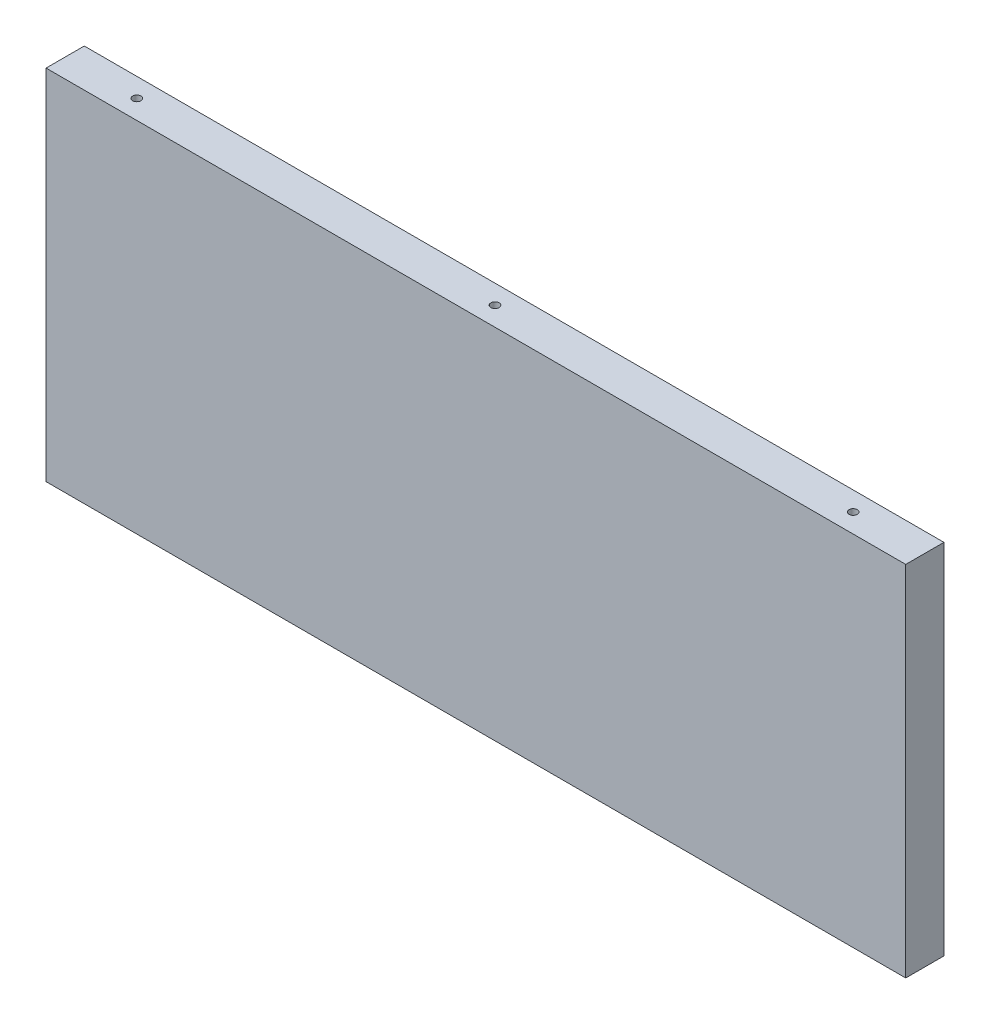
ISO-10303-21;
HEADER;
FILE_DESCRIPTION(('STEP AP214'),'2;1');
FILE_NAME('part.step','',(''),(''),'','','');
FILE_SCHEMA(('AUTOMOTIVE_DESIGN { 1 0 10303 214 1 1 1 1 }'));
ENDSEC;
DATA;
#1=APPLICATION_CONTEXT('core data for automotive mechanical design processes');
#2=APPLICATION_PROTOCOL_DEFINITION('international standard','automotive_design',2000,#1);
#3=PRODUCT_CONTEXT('',#1,'mechanical');
#4=PRODUCT('Part','Part','',(#3));
#5=PRODUCT_RELATED_PRODUCT_CATEGORY('part','',(#4));
#6=PRODUCT_DEFINITION_FORMATION('','',#4);
#7=PRODUCT_DEFINITION_CONTEXT('part definition',#1,'design');
#8=PRODUCT_DEFINITION('design','',#6,#7);
#9=PRODUCT_DEFINITION_SHAPE('','',#8);
#10=(LENGTH_UNIT() NAMED_UNIT(*) SI_UNIT(.MILLI.,.METRE.));
#11=(NAMED_UNIT(*) PLANE_ANGLE_UNIT() SI_UNIT($,.RADIAN.));
#12=(NAMED_UNIT(*) SI_UNIT($,.STERADIAN.) SOLID_ANGLE_UNIT());
#13=UNCERTAINTY_MEASURE_WITH_UNIT(LENGTH_MEASURE(1.E-05),#10,'distance_accuracy_value','');
#14=(GEOMETRIC_REPRESENTATION_CONTEXT(3) GLOBAL_UNCERTAINTY_ASSIGNED_CONTEXT((#13)) GLOBAL_UNIT_ASSIGNED_CONTEXT((#10,
#11,#12)) REPRESENTATION_CONTEXT('',''));
#15=CARTESIAN_POINT('',(0.,0.,0.));
#16=DIRECTION('',(0.,0.,1.));
#17=DIRECTION('',(1.,0.,0.));
#18=AXIS2_PLACEMENT_3D('',#15,#16,#17);
#19=CARTESIAN_POINT('',(180.,-75.,8.));
#20=DIRECTION('',(-1.,0.,0.));
#21=DIRECTION('',(0.,0.,1.));
#22=AXIS2_PLACEMENT_3D('',#19,#20,#21);
#23=PLANE('',#22);
#24=DIRECTION('',(0.,1.,0.));
#25=VECTOR('',#24,1.);
#26=CARTESIAN_POINT('',(180.,-75.,-8.));
#27=LINE('',#26,#25);
#28=CARTESIAN_POINT('',(180.,-75.,-8.));
#29=VERTEX_POINT('',#28);
#30=CARTESIAN_POINT('',(180.,75.,-8.));
#31=VERTEX_POINT('',#30);
#32=EDGE_CURVE('E187',#29,#31,#27,.T.);
#33=ORIENTED_EDGE('',*,*,#32,.T.);
#34=DIRECTION('',(0.,0.,-1.));
#35=VECTOR('',#34,1.);
#36=CARTESIAN_POINT('',(180.,75.,8.));
#37=LINE('',#36,#35);
#38=CARTESIAN_POINT('',(180.,75.,8.));
#39=VERTEX_POINT('',#38);
#40=EDGE_CURVE('E11',#39,#31,#37,.T.);
#41=ORIENTED_EDGE('',*,*,#40,.F.);
#42=DIRECTION('',(0.,1.,0.));
#43=VECTOR('',#42,1.);
#44=CARTESIAN_POINT('',(180.,-75.,8.));
#45=LINE('',#44,#43);
#46=CARTESIAN_POINT('',(180.,-75.,8.));
#47=VERTEX_POINT('',#46);
#48=EDGE_CURVE('E188',#47,#39,#45,.T.);
#49=ORIENTED_EDGE('',*,*,#48,.F.);
#50=DIRECTION('',(0.,0.,-1.));
#51=VECTOR('',#50,1.);
#52=CARTESIAN_POINT('',(180.,-75.,8.));
#53=LINE('',#52,#51);
#54=EDGE_CURVE('E194',#47,#29,#53,.T.);
#55=ORIENTED_EDGE('',*,*,#54,.T.);
#56=EDGE_LOOP('',(#33,#41,#49,#55));
#57=FACE_BOUND('',#56,.T.);
#58=ADVANCED_FACE('F49',(#57),#23,.F.);
#59=CARTESIAN_POINT('',(-180.,75.,8.));
#60=DIRECTION('',(0.,-1.,0.));
#61=DIRECTION('',(0.,0.,-1.));
#62=AXIS2_PLACEMENT_3D('',#59,#60,#61);
#63=PLANE('',#62);
#64=CARTESIAN_POINT('',(150.,75.,0.));
#65=DIRECTION('',(0.,1.,0.));
#66=DIRECTION('',(0.,0.,1.));
#67=AXIS2_PLACEMENT_3D('',#64,#65,#66);
#68=CIRCLE('',#67,1.72719999999998);
#69=CARTESIAN_POINT('',(150.,75.,1.72720000000001));
#70=VERTEX_POINT('',#69);
#71=EDGE_CURVE('E135',#70,#70,#68,.T.);
#72=ORIENTED_EDGE('',*,*,#71,.F.);
#73=EDGE_LOOP('',(#72));
#74=FACE_BOUND('',#73,.T.);
#75=CARTESIAN_POINT('',(0.,75.,0.));
#76=DIRECTION('',(0.,1.,0.));
#77=DIRECTION('',(0.,0.,1.));
#78=AXIS2_PLACEMENT_3D('',#75,#76,#77);
#79=CIRCLE('',#78,1.7272);
#80=CARTESIAN_POINT('',(0.,75.,1.72720000000002));
#81=VERTEX_POINT('',#80);
#82=EDGE_CURVE('E134',#81,#81,#79,.T.);
#83=ORIENTED_EDGE('',*,*,#82,.F.);
#84=EDGE_LOOP('',(#83));
#85=FACE_BOUND('',#84,.T.);
#86=CARTESIAN_POINT('',(-150.,75.,0.));
#87=DIRECTION('',(0.,1.,0.));
#88=DIRECTION('',(0.,0.,1.));
#89=AXIS2_PLACEMENT_3D('',#86,#87,#88);
#90=CIRCLE('',#89,1.72719999999998);
#91=CARTESIAN_POINT('',(-150.,75.,1.72720000000001));
#92=VERTEX_POINT('',#91);
#93=EDGE_CURVE('E145',#92,#92,#90,.T.);
#94=ORIENTED_EDGE('',*,*,#93,.F.);
#95=EDGE_LOOP('',(#94));
#96=FACE_BOUND('',#95,.T.);
#97=DIRECTION('',(-1.,0.,0.));
#98=VECTOR('',#97,1.);
#99=CARTESIAN_POINT('',(-180.,75.,-8.));
#100=LINE('',#99,#98);
#101=CARTESIAN_POINT('',(-180.,75.,-8.));
#102=VERTEX_POINT('',#101);
#103=EDGE_CURVE('E197',#31,#102,#100,.T.);
#104=ORIENTED_EDGE('',*,*,#103,.T.);
#105=DIRECTION('',(0.,0.,-1.));
#106=VECTOR('',#105,1.);
#107=CARTESIAN_POINT('',(-180.,75.,8.));
#108=LINE('',#107,#106);
#109=CARTESIAN_POINT('',(-180.,75.,8.));
#110=VERTEX_POINT('',#109);
#111=EDGE_CURVE('E57',#110,#102,#108,.T.);
#112=ORIENTED_EDGE('',*,*,#111,.F.);
#113=DIRECTION('',(-1.,0.,0.));
#114=VECTOR('',#113,1.);
#115=CARTESIAN_POINT('',(-180.,75.,8.));
#116=LINE('',#115,#114);
#117=EDGE_CURVE('E96',#39,#110,#116,.T.);
#118=ORIENTED_EDGE('',*,*,#117,.F.);
#119=ORIENTED_EDGE('',*,*,#40,.T.);
#120=EDGE_LOOP('',(#104,#112,#118,#119));
#121=FACE_BOUND('',#120,.T.);
#122=ADVANCED_FACE('F223',(#74,#85,#96,#121),#63,.F.);
#123=CARTESIAN_POINT('',(-180.,-75.,8.));
#124=DIRECTION('',(1.,0.,0.));
#125=DIRECTION('',(0.,0.,-1.));
#126=AXIS2_PLACEMENT_3D('',#123,#124,#125);
#127=PLANE('',#126);
#128=DIRECTION('',(0.,-1.,0.));
#129=VECTOR('',#128,1.);
#130=CARTESIAN_POINT('',(-180.,-75.,-8.));
#131=LINE('',#130,#129);
#132=CARTESIAN_POINT('',(-180.,-75.,-8.));
#133=VERTEX_POINT('',#132);
#134=EDGE_CURVE('E83',#102,#133,#131,.T.);
#135=ORIENTED_EDGE('',*,*,#134,.T.);
#136=DIRECTION('',(0.,0.,-1.));
#137=VECTOR('',#136,1.);
#138=CARTESIAN_POINT('',(-180.,-75.,8.));
#139=LINE('',#138,#137);
#140=CARTESIAN_POINT('',(-180.,-75.,8.));
#141=VERTEX_POINT('',#140);
#142=EDGE_CURVE('E202',#141,#133,#139,.T.);
#143=ORIENTED_EDGE('',*,*,#142,.F.);
#144=DIRECTION('',(0.,-1.,0.));
#145=VECTOR('',#144,1.);
#146=CARTESIAN_POINT('',(-180.,-75.,8.));
#147=LINE('',#146,#145);
#148=EDGE_CURVE('E191',#110,#141,#147,.T.);
#149=ORIENTED_EDGE('',*,*,#148,.F.);
#150=ORIENTED_EDGE('',*,*,#111,.T.);
#151=EDGE_LOOP('',(#135,#143,#149,#150));
#152=FACE_BOUND('',#151,.T.);
#153=ADVANCED_FACE('F204',(#152),#127,.F.);
#154=CARTESIAN_POINT('',(-180.,-75.,8.));
#155=DIRECTION('',(0.,1.,0.));
#156=DIRECTION('',(0.,0.,1.));
#157=AXIS2_PLACEMENT_3D('',#154,#155,#156);
#158=PLANE('',#157);
#159=CARTESIAN_POINT('',(127.,-75.,0.));
#160=DIRECTION('',(0.,-1.,0.));
#161=DIRECTION('',(0.,0.,-1.));
#162=AXIS2_PLACEMENT_3D('',#159,#160,#161);
#163=CIRCLE('',#162,5.);
#164=CARTESIAN_POINT('',(127.,-75.,-5.));
#165=VERTEX_POINT('',#164);
#166=EDGE_CURVE('E151',#165,#165,#163,.T.);
#167=ORIENTED_EDGE('',*,*,#166,.F.);
#168=EDGE_LOOP('',(#167));
#169=FACE_BOUND('',#168,.T.);
#170=CARTESIAN_POINT('',(142.5,-75.,0.));
#171=DIRECTION('',(0.,-1.,0.));
#172=DIRECTION('',(0.,0.,-1.));
#173=AXIS2_PLACEMENT_3D('',#170,#171,#172);
#174=CIRCLE('',#173,1.72719999999998);
#175=CARTESIAN_POINT('',(142.5,-75.,-1.72719999999998));
#176=VERTEX_POINT('',#175);
#177=EDGE_CURVE('E157',#176,#176,#174,.T.);
#178=ORIENTED_EDGE('',*,*,#177,.F.);
#179=EDGE_LOOP('',(#178));
#180=FACE_BOUND('',#179,.T.);
#181=CARTESIAN_POINT('',(111.5,-75.,0.));
#182=DIRECTION('',(0.,-1.,0.));
#183=DIRECTION('',(0.,0.,-1.));
#184=AXIS2_PLACEMENT_3D('',#181,#182,#183);
#185=CIRCLE('',#184,1.7272);
#186=CARTESIAN_POINT('',(111.5,-75.,-1.7272));
#187=VERTEX_POINT('',#186);
#188=EDGE_CURVE('E163',#187,#187,#185,.T.);
#189=ORIENTED_EDGE('',*,*,#188,.F.);
#190=EDGE_LOOP('',(#189));
#191=FACE_BOUND('',#190,.T.);
#192=CARTESIAN_POINT('',(-127.,-75.,0.));
#193=DIRECTION('',(0.,-1.,0.));
#194=DIRECTION('',(0.,0.,-1.));
#195=AXIS2_PLACEMENT_3D('',#192,#193,#194);
#196=CIRCLE('',#195,4.99999999999999);
#197=CARTESIAN_POINT('',(-127.,-75.,-4.99999999999999));
#198=VERTEX_POINT('',#197);
#199=EDGE_CURVE('E169',#198,#198,#196,.T.);
#200=ORIENTED_EDGE('',*,*,#199,.F.);
#201=EDGE_LOOP('',(#200));
#202=FACE_BOUND('',#201,.T.);
#203=CARTESIAN_POINT('',(-142.5,-75.,0.));
#204=DIRECTION('',(0.,-1.,0.));
#205=DIRECTION('',(0.,0.,-1.));
#206=AXIS2_PLACEMENT_3D('',#203,#204,#205);
#207=CIRCLE('',#206,1.72719999999998);
#208=CARTESIAN_POINT('',(-142.5,-75.,-1.72719999999998));
#209=VERTEX_POINT('',#208);
#210=EDGE_CURVE('E175',#209,#209,#207,.T.);
#211=ORIENTED_EDGE('',*,*,#210,.F.);
#212=EDGE_LOOP('',(#211));
#213=FACE_BOUND('',#212,.T.);
#214=CARTESIAN_POINT('',(-111.5,-75.,0.));
#215=DIRECTION('',(0.,-1.,0.));
#216=DIRECTION('',(0.,0.,-1.));
#217=AXIS2_PLACEMENT_3D('',#214,#215,#216);
#218=CIRCLE('',#217,1.7272);
#219=CARTESIAN_POINT('',(-111.5,-75.,-1.7272));
#220=VERTEX_POINT('',#219);
#221=EDGE_CURVE('E181',#220,#220,#218,.T.);
#222=ORIENTED_EDGE('',*,*,#221,.F.);
#223=EDGE_LOOP('',(#222));
#224=FACE_BOUND('',#223,.T.);
#225=DIRECTION('',(1.,0.,0.));
#226=VECTOR('',#225,1.);
#227=CARTESIAN_POINT('',(-180.,-75.,-8.));
#228=LINE('',#227,#226);
#229=EDGE_CURVE('E89',#133,#29,#228,.T.);
#230=ORIENTED_EDGE('',*,*,#229,.T.);
#231=ORIENTED_EDGE('',*,*,#54,.F.);
#232=DIRECTION('',(1.,0.,0.));
#233=VECTOR('',#232,1.);
#234=CARTESIAN_POINT('',(-180.,-75.,8.));
#235=LINE('',#234,#233);
#236=EDGE_CURVE('E65',#141,#47,#235,.T.);
#237=ORIENTED_EDGE('',*,*,#236,.F.);
#238=ORIENTED_EDGE('',*,*,#142,.T.);
#239=EDGE_LOOP('',(#230,#231,#237,#238));
#240=FACE_BOUND('',#239,.T.);
#241=ADVANCED_FACE('F211',(#169,#180,#191,#202,#213,#224,#240),#158,.F.);
#242=CARTESIAN_POINT('',(0.,0.,8.));
#243=DIRECTION('',(0.,0.,-1.));
#244=DIRECTION('',(-1.,0.,0.));
#245=AXIS2_PLACEMENT_3D('',#242,#243,#244);
#246=PLANE('',#245);
#247=ORIENTED_EDGE('',*,*,#48,.T.);
#248=ORIENTED_EDGE('',*,*,#117,.T.);
#249=ORIENTED_EDGE('',*,*,#148,.T.);
#250=ORIENTED_EDGE('',*,*,#236,.T.);
#251=EDGE_LOOP('',(#247,#248,#249,#250));
#252=FACE_BOUND('',#251,.T.);
#253=ADVANCED_FACE('F213',(#252),#246,.F.);
#254=CARTESIAN_POINT('',(0.,0.,-8.));
#255=DIRECTION('',(0.,0.,-1.));
#256=DIRECTION('',(-1.,0.,0.));
#257=AXIS2_PLACEMENT_3D('',#254,#255,#256);
#258=PLANE('',#257);
#259=ORIENTED_EDGE('',*,*,#32,.F.);
#260=ORIENTED_EDGE('',*,*,#229,.F.);
#261=ORIENTED_EDGE('',*,*,#134,.F.);
#262=ORIENTED_EDGE('',*,*,#103,.F.);
#263=EDGE_LOOP('',(#259,#260,#261,#262));
#264=FACE_BOUND('',#263,.T.);
#265=ADVANCED_FACE('F207',(#264),#258,.T.);
#266=CARTESIAN_POINT('',(-111.5,-50.,0.));
#267=DIRECTION('',(0.,-1.,0.));
#268=DIRECTION('',(0.,0.,-1.));
#269=AXIS2_PLACEMENT_3D('',#266,#267,#268);
#270=CONICAL_SURFACE('',#269,1.7272,1.02974425867665);
#271=CARTESIAN_POINT('',(-111.5,-48.9621935388156,0.));
#272=VERTEX_POINT('',#271);
#273=VERTEX_LOOP('',#272);
#274=FACE_BOUND('',#273,.T.);
#275=CARTESIAN_POINT('',(-111.5,-50.,0.));
#276=DIRECTION('',(0.,-1.,0.));
#277=DIRECTION('',(0.,0.,-1.));
#278=AXIS2_PLACEMENT_3D('',#275,#276,#277);
#279=CIRCLE('',#278,1.7272);
#280=CARTESIAN_POINT('',(-111.5,-50.,-1.7272));
#281=VERTEX_POINT('',#280);
#282=EDGE_CURVE('E184',#281,#281,#279,.T.);
#283=ORIENTED_EDGE('',*,*,#282,.T.);
#284=EDGE_LOOP('',(#283));
#285=FACE_BOUND('',#284,.T.);
#286=ADVANCED_FACE('F304',(#274,#285),#270,.F.);
#287=CARTESIAN_POINT('',(-111.5,-75.,0.));
#288=DIRECTION('',(0.,-1.,0.));
#289=DIRECTION('',(0.,0.,-1.));
#290=AXIS2_PLACEMENT_3D('',#287,#288,#289);
#291=CYLINDRICAL_SURFACE('',#290,1.7272);
#292=ORIENTED_EDGE('',*,*,#282,.F.);
#293=EDGE_LOOP('',(#292));
#294=FACE_BOUND('',#293,.T.);
#295=ORIENTED_EDGE('',*,*,#221,.T.);
#296=EDGE_LOOP('',(#295));
#297=FACE_BOUND('',#296,.T.);
#298=ADVANCED_FACE('F300',(#294,#297),#291,.F.);
#299=CARTESIAN_POINT('',(-142.5,-50.,0.));
#300=DIRECTION('',(0.,-1.,0.));
#301=DIRECTION('',(0.,0.,-1.));
#302=AXIS2_PLACEMENT_3D('',#299,#300,#301);
#303=CONICAL_SURFACE('',#302,1.72719999999998,1.02974425867665);
#304=CARTESIAN_POINT('',(-142.5,-48.9621935388156,0.));
#305=VERTEX_POINT('',#304);
#306=VERTEX_LOOP('',#305);
#307=FACE_BOUND('',#306,.T.);
#308=CARTESIAN_POINT('',(-142.5,-50.,0.));
#309=DIRECTION('',(0.,-1.,0.));
#310=DIRECTION('',(0.,0.,-1.));
#311=AXIS2_PLACEMENT_3D('',#308,#309,#310);
#312=CIRCLE('',#311,1.72719999999998);
#313=CARTESIAN_POINT('',(-142.5,-50.,-1.72719999999998));
#314=VERTEX_POINT('',#313);
#315=EDGE_CURVE('E178',#314,#314,#312,.T.);
#316=ORIENTED_EDGE('',*,*,#315,.T.);
#317=EDGE_LOOP('',(#316));
#318=FACE_BOUND('',#317,.T.);
#319=ADVANCED_FACE('F296',(#307,#318),#303,.F.);
#320=CARTESIAN_POINT('',(-142.5,-75.,0.));
#321=DIRECTION('',(0.,-1.,0.));
#322=DIRECTION('',(0.,0.,-1.));
#323=AXIS2_PLACEMENT_3D('',#320,#321,#322);
#324=CYLINDRICAL_SURFACE('',#323,1.72719999999998);
#325=ORIENTED_EDGE('',*,*,#315,.F.);
#326=EDGE_LOOP('',(#325));
#327=FACE_BOUND('',#326,.T.);
#328=ORIENTED_EDGE('',*,*,#210,.T.);
#329=EDGE_LOOP('',(#328));
#330=FACE_BOUND('',#329,.T.);
#331=ADVANCED_FACE('F292',(#327,#330),#324,.F.);
#332=CARTESIAN_POINT('',(-127.,-30.,0.));
#333=DIRECTION('',(0.,-1.,0.));
#334=DIRECTION('',(0.,0.,-1.));
#335=AXIS2_PLACEMENT_3D('',#332,#333,#334);
#336=CONICAL_SURFACE('',#335,4.99999999999999,1.02974425867665);
#337=CARTESIAN_POINT('',(-127.,-26.9956969048622,0.));
#338=VERTEX_POINT('',#337);
#339=VERTEX_LOOP('',#338);
#340=FACE_BOUND('',#339,.T.);
#341=CARTESIAN_POINT('',(-127.,-30.,0.));
#342=DIRECTION('',(0.,-1.,0.));
#343=DIRECTION('',(0.,0.,-1.));
#344=AXIS2_PLACEMENT_3D('',#341,#342,#343);
#345=CIRCLE('',#344,4.99999999999999);
#346=CARTESIAN_POINT('',(-127.,-30.,-4.99999999999999));
#347=VERTEX_POINT('',#346);
#348=EDGE_CURVE('E172',#347,#347,#345,.T.);
#349=ORIENTED_EDGE('',*,*,#348,.T.);
#350=EDGE_LOOP('',(#349));
#351=FACE_BOUND('',#350,.T.);
#352=ADVANCED_FACE('F288',(#340,#351),#336,.F.);
#353=CARTESIAN_POINT('',(-127.,-75.,0.));
#354=DIRECTION('',(0.,-1.,0.));
#355=DIRECTION('',(0.,0.,-1.));
#356=AXIS2_PLACEMENT_3D('',#353,#354,#355);
#357=CYLINDRICAL_SURFACE('',#356,4.99999999999999);
#358=ORIENTED_EDGE('',*,*,#348,.F.);
#359=EDGE_LOOP('',(#358));
#360=FACE_BOUND('',#359,.T.);
#361=ORIENTED_EDGE('',*,*,#199,.T.);
#362=EDGE_LOOP('',(#361));
#363=FACE_BOUND('',#362,.T.);
#364=ADVANCED_FACE('F284',(#360,#363),#357,.F.);
#365=CARTESIAN_POINT('',(111.5,-50.,0.));
#366=DIRECTION('',(0.,-1.,0.));
#367=DIRECTION('',(0.,0.,-1.));
#368=AXIS2_PLACEMENT_3D('',#365,#366,#367);
#369=CONICAL_SURFACE('',#368,1.7272,1.02974425867665);
#370=CARTESIAN_POINT('',(111.5,-48.9621935388156,0.));
#371=VERTEX_POINT('',#370);
#372=VERTEX_LOOP('',#371);
#373=FACE_BOUND('',#372,.T.);
#374=CARTESIAN_POINT('',(111.5,-50.,0.));
#375=DIRECTION('',(0.,-1.,0.));
#376=DIRECTION('',(0.,0.,-1.));
#377=AXIS2_PLACEMENT_3D('',#374,#375,#376);
#378=CIRCLE('',#377,1.7272);
#379=CARTESIAN_POINT('',(111.5,-50.,-1.7272));
#380=VERTEX_POINT('',#379);
#381=EDGE_CURVE('E166',#380,#380,#378,.T.);
#382=ORIENTED_EDGE('',*,*,#381,.T.);
#383=EDGE_LOOP('',(#382));
#384=FACE_BOUND('',#383,.T.);
#385=ADVANCED_FACE('F280',(#373,#384),#369,.F.);
#386=CARTESIAN_POINT('',(111.5,-75.,0.));
#387=DIRECTION('',(0.,-1.,0.));
#388=DIRECTION('',(0.,0.,-1.));
#389=AXIS2_PLACEMENT_3D('',#386,#387,#388);
#390=CYLINDRICAL_SURFACE('',#389,1.7272);
#391=ORIENTED_EDGE('',*,*,#381,.F.);
#392=EDGE_LOOP('',(#391));
#393=FACE_BOUND('',#392,.T.);
#394=ORIENTED_EDGE('',*,*,#188,.T.);
#395=EDGE_LOOP('',(#394));
#396=FACE_BOUND('',#395,.T.);
#397=ADVANCED_FACE('F276',(#393,#396),#390,.F.);
#398=CARTESIAN_POINT('',(142.5,-50.,0.));
#399=DIRECTION('',(0.,-1.,0.));
#400=DIRECTION('',(0.,0.,-1.));
#401=AXIS2_PLACEMENT_3D('',#398,#399,#400);
#402=CONICAL_SURFACE('',#401,1.72719999999998,1.02974425867665);
#403=CARTESIAN_POINT('',(142.5,-48.9621935388156,0.));
#404=VERTEX_POINT('',#403);
#405=VERTEX_LOOP('',#404);
#406=FACE_BOUND('',#405,.T.);
#407=CARTESIAN_POINT('',(142.5,-50.,0.));
#408=DIRECTION('',(0.,-1.,0.));
#409=DIRECTION('',(0.,0.,-1.));
#410=AXIS2_PLACEMENT_3D('',#407,#408,#409);
#411=CIRCLE('',#410,1.72719999999998);
#412=CARTESIAN_POINT('',(142.5,-50.,-1.72719999999998));
#413=VERTEX_POINT('',#412);
#414=EDGE_CURVE('E160',#413,#413,#411,.T.);
#415=ORIENTED_EDGE('',*,*,#414,.T.);
#416=EDGE_LOOP('',(#415));
#417=FACE_BOUND('',#416,.T.);
#418=ADVANCED_FACE('F272',(#406,#417),#402,.F.);
#419=CARTESIAN_POINT('',(142.5,-75.,0.));
#420=DIRECTION('',(0.,-1.,0.));
#421=DIRECTION('',(0.,0.,-1.));
#422=AXIS2_PLACEMENT_3D('',#419,#420,#421);
#423=CYLINDRICAL_SURFACE('',#422,1.72719999999998);
#424=ORIENTED_EDGE('',*,*,#414,.F.);
#425=EDGE_LOOP('',(#424));
#426=FACE_BOUND('',#425,.T.);
#427=ORIENTED_EDGE('',*,*,#177,.T.);
#428=EDGE_LOOP('',(#427));
#429=FACE_BOUND('',#428,.T.);
#430=ADVANCED_FACE('F268',(#426,#429),#423,.F.);
#431=CARTESIAN_POINT('',(127.,-30.,0.));
#432=DIRECTION('',(0.,-1.,0.));
#433=DIRECTION('',(0.,0.,-1.));
#434=AXIS2_PLACEMENT_3D('',#431,#432,#433);
#435=CONICAL_SURFACE('',#434,4.99999999999998,1.02974425867665);
#436=CARTESIAN_POINT('',(127.,-26.9956969048622,0.));
#437=VERTEX_POINT('',#436);
#438=VERTEX_LOOP('',#437);
#439=FACE_BOUND('',#438,.T.);
#440=CARTESIAN_POINT('',(127.,-30.,0.));
#441=DIRECTION('',(0.,-1.,0.));
#442=DIRECTION('',(0.,0.,-1.));
#443=AXIS2_PLACEMENT_3D('',#440,#441,#442);
#444=CIRCLE('',#443,4.99999999999998);
#445=CARTESIAN_POINT('',(127.,-30.,-4.99999999999998));
#446=VERTEX_POINT('',#445);
#447=EDGE_CURVE('E154',#446,#446,#444,.T.);
#448=ORIENTED_EDGE('',*,*,#447,.T.);
#449=EDGE_LOOP('',(#448));
#450=FACE_BOUND('',#449,.T.);
#451=ADVANCED_FACE('F264',(#439,#450),#435,.F.);
#452=CARTESIAN_POINT('',(127.,-75.,0.));
#453=DIRECTION('',(0.,-1.,0.));
#454=DIRECTION('',(0.,0.,-1.));
#455=AXIS2_PLACEMENT_3D('',#452,#453,#454);
#456=CYLINDRICAL_SURFACE('',#455,4.99999999999999);
#457=ORIENTED_EDGE('',*,*,#447,.F.);
#458=EDGE_LOOP('',(#457));
#459=FACE_BOUND('',#458,.T.);
#460=ORIENTED_EDGE('',*,*,#166,.T.);
#461=EDGE_LOOP('',(#460));
#462=FACE_BOUND('',#461,.T.);
#463=ADVANCED_FACE('F256',(#459,#462),#456,.F.);
#464=CARTESIAN_POINT('',(-150.,50.,0.));
#465=DIRECTION('',(0.,1.,0.));
#466=DIRECTION('',(0.,0.,1.));
#467=AXIS2_PLACEMENT_3D('',#464,#465,#466);
#468=CONICAL_SURFACE('',#467,1.72719999999998,1.02974425867665);
#469=CARTESIAN_POINT('',(-150.,48.9621935388156,0.));
#470=VERTEX_POINT('',#469);
#471=VERTEX_LOOP('',#470);
#472=FACE_BOUND('',#471,.T.);
#473=CARTESIAN_POINT('',(-150.,50.,0.));
#474=DIRECTION('',(0.,1.,0.));
#475=DIRECTION('',(0.,0.,1.));
#476=AXIS2_PLACEMENT_3D('',#473,#474,#475);
#477=CIRCLE('',#476,1.72719999999998);
#478=CARTESIAN_POINT('',(-150.,50.,1.72720000000001));
#479=VERTEX_POINT('',#478);
#480=EDGE_CURVE('E148',#479,#479,#477,.T.);
#481=ORIENTED_EDGE('',*,*,#480,.T.);
#482=EDGE_LOOP('',(#481));
#483=FACE_BOUND('',#482,.T.);
#484=ADVANCED_FACE('F245',(#472,#483),#468,.F.);
#485=CARTESIAN_POINT('',(-150.,75.,0.));
#486=DIRECTION('',(0.,1.,0.));
#487=DIRECTION('',(0.,0.,1.));
#488=AXIS2_PLACEMENT_3D('',#485,#486,#487);
#489=CYLINDRICAL_SURFACE('',#488,1.72719999999998);
#490=ORIENTED_EDGE('',*,*,#480,.F.);
#491=EDGE_LOOP('',(#490));
#492=FACE_BOUND('',#491,.T.);
#493=ORIENTED_EDGE('',*,*,#93,.T.);
#494=EDGE_LOOP('',(#493));
#495=FACE_BOUND('',#494,.T.);
#496=ADVANCED_FACE('F242',(#492,#495),#489,.F.);
#497=CARTESIAN_POINT('',(0.,50.,0.));
#498=DIRECTION('',(0.,1.,0.));
#499=DIRECTION('',(0.,0.,1.));
#500=AXIS2_PLACEMENT_3D('',#497,#498,#499);
#501=CONICAL_SURFACE('',#500,1.72719999999999,1.02974425867665);
#502=CARTESIAN_POINT('',(0.,48.9621935388156,0.));
#503=VERTEX_POINT('',#502);
#504=VERTEX_LOOP('',#503);
#505=FACE_BOUND('',#504,.T.);
#506=CARTESIAN_POINT('',(0.,50.,0.));
#507=DIRECTION('',(0.,1.,0.));
#508=DIRECTION('',(0.,0.,1.));
#509=AXIS2_PLACEMENT_3D('',#506,#507,#508);
#510=CIRCLE('',#509,1.72719999999999);
#511=CARTESIAN_POINT('',(0.,50.,1.72720000000002));
#512=VERTEX_POINT('',#511);
#513=EDGE_CURVE('E138',#512,#512,#510,.T.);
#514=ORIENTED_EDGE('',*,*,#513,.T.);
#515=EDGE_LOOP('',(#514));
#516=FACE_BOUND('',#515,.T.);
#517=ADVANCED_FACE('F244',(#505,#516),#501,.F.);
#518=CARTESIAN_POINT('',(0.,75.,0.));
#519=DIRECTION('',(0.,1.,0.));
#520=DIRECTION('',(0.,0.,1.));
#521=AXIS2_PLACEMENT_3D('',#518,#519,#520);
#522=CYLINDRICAL_SURFACE('',#521,1.7272);
#523=ORIENTED_EDGE('',*,*,#513,.F.);
#524=EDGE_LOOP('',(#523));
#525=FACE_BOUND('',#524,.T.);
#526=ORIENTED_EDGE('',*,*,#82,.T.);
#527=EDGE_LOOP('',(#526));
#528=FACE_BOUND('',#527,.T.);
#529=ADVANCED_FACE('F128',(#525,#528),#522,.F.);
#530=CARTESIAN_POINT('',(150.,50.,0.));
#531=DIRECTION('',(0.,1.,0.));
#532=DIRECTION('',(0.,0.,1.));
#533=AXIS2_PLACEMENT_3D('',#530,#531,#532);
#534=CONICAL_SURFACE('',#533,1.72719999999998,1.02974425867665);
#535=CARTESIAN_POINT('',(150.,48.9621935388156,0.));
#536=VERTEX_POINT('',#535);
#537=VERTEX_LOOP('',#536);
#538=FACE_BOUND('',#537,.T.);
#539=CARTESIAN_POINT('',(150.,50.,0.));
#540=DIRECTION('',(0.,1.,0.));
#541=DIRECTION('',(0.,0.,1.));
#542=AXIS2_PLACEMENT_3D('',#539,#540,#541);
#543=CIRCLE('',#542,1.72719999999998);
#544=CARTESIAN_POINT('',(150.,50.,1.72720000000001));
#545=VERTEX_POINT('',#544);
#546=EDGE_CURVE('E132',#545,#545,#543,.T.);
#547=ORIENTED_EDGE('',*,*,#546,.T.);
#548=EDGE_LOOP('',(#547));
#549=FACE_BOUND('',#548,.T.);
#550=ADVANCED_FACE('F124',(#538,#549),#534,.F.);
#551=CARTESIAN_POINT('',(150.,75.,0.));
#552=DIRECTION('',(0.,1.,0.));
#553=DIRECTION('',(0.,0.,1.));
#554=AXIS2_PLACEMENT_3D('',#551,#552,#553);
#555=CYLINDRICAL_SURFACE('',#554,1.72719999999998);
#556=ORIENTED_EDGE('',*,*,#546,.F.);
#557=EDGE_LOOP('',(#556));
#558=FACE_BOUND('',#557,.T.);
#559=ORIENTED_EDGE('',*,*,#71,.T.);
#560=EDGE_LOOP('',(#559));
#561=FACE_BOUND('',#560,.T.);
#562=ADVANCED_FACE('F127',(#558,#561),#555,.F.);
#563=CLOSED_SHELL('',(#58,#122,#153,#241,#253,#265,#286,#298,#319,#331,#352,#364,#385,#397,#418,
#430,#451,#463,#484,#496,#517,#529,#550,#562));
#564=MANIFOLD_SOLID_BREP('B2',#563);
#565=ADVANCED_BREP_SHAPE_REPRESENTATION('',(#18,#564),#14);
#566=SHAPE_DEFINITION_REPRESENTATION(#9,#565);
ENDSEC;
END-ISO-10303-21;
